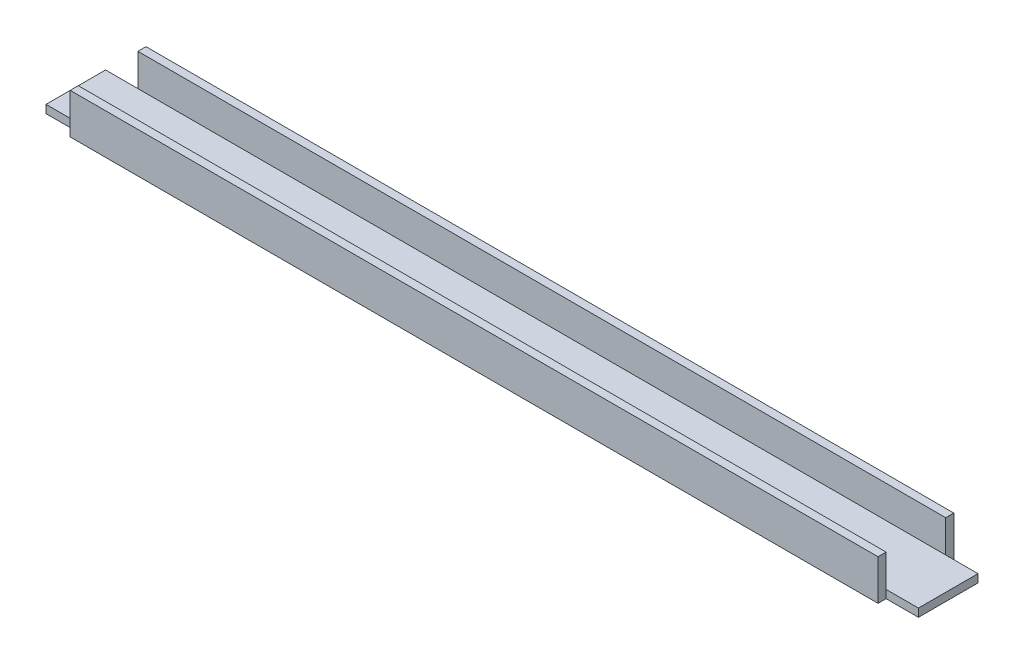
ISO-10303-21;
HEADER;
FILE_DESCRIPTION(('STEP AP214'),'2;1');
FILE_NAME('part.step','',(''),(''),'','','');
FILE_SCHEMA(('AUTOMOTIVE_DESIGN { 1 0 10303 214 1 1 1 1 }'));
ENDSEC;
DATA;
#1=APPLICATION_CONTEXT('core data for automotive mechanical design processes');
#2=APPLICATION_PROTOCOL_DEFINITION('international standard','automotive_design',2000,#1);
#3=PRODUCT_CONTEXT('',#1,'mechanical');
#4=PRODUCT('Part','Part','',(#3));
#5=PRODUCT_RELATED_PRODUCT_CATEGORY('part','',(#4));
#6=PRODUCT_DEFINITION_FORMATION('','',#4);
#7=PRODUCT_DEFINITION_CONTEXT('part definition',#1,'design');
#8=PRODUCT_DEFINITION('design','',#6,#7);
#9=PRODUCT_DEFINITION_SHAPE('','',#8);
#10=(LENGTH_UNIT() NAMED_UNIT(*) SI_UNIT(.MILLI.,.METRE.));
#11=(NAMED_UNIT(*) PLANE_ANGLE_UNIT() SI_UNIT($,.RADIAN.));
#12=(NAMED_UNIT(*) SI_UNIT($,.STERADIAN.) SOLID_ANGLE_UNIT());
#13=UNCERTAINTY_MEASURE_WITH_UNIT(LENGTH_MEASURE(1.E-05),#10,'distance_accuracy_value','');
#14=(GEOMETRIC_REPRESENTATION_CONTEXT(3) GLOBAL_UNCERTAINTY_ASSIGNED_CONTEXT((#13)) GLOBAL_UNIT_ASSIGNED_CONTEXT((#10,
#11,#12)) REPRESENTATION_CONTEXT('',''));
#15=CARTESIAN_POINT('',(0.,0.,0.));
#16=DIRECTION('',(0.,0.,1.));
#17=DIRECTION('',(1.,0.,0.));
#18=AXIS2_PLACEMENT_3D('',#15,#16,#17);
#19=CARTESIAN_POINT('',(400.,1.46957615897682E-13,0.));
#20=DIRECTION('',(-1.,0.,0.));
#21=DIRECTION('',(0.,0.,1.));
#22=AXIS2_PLACEMENT_3D('',#19,#20,#21);
#23=PLANE('',#22);
#24=DIRECTION('',(0.,-1.,0.));
#25=VECTOR('',#24,1.);
#26=CARTESIAN_POINT('',(400.,8.00000000000007,29.5));
#27=LINE('',#26,#25);
#28=CARTESIAN_POINT('',(400.,8.00000000000007,29.5));
#29=VERTEX_POINT('',#28);
#30=CARTESIAN_POINT('',(400.,0.,29.5));
#31=VERTEX_POINT('',#30);
#32=EDGE_CURVE('E199',#29,#31,#27,.T.);
#33=ORIENTED_EDGE('',*,*,#32,.F.);
#34=DIRECTION('',(0.,1.,0.));
#35=VECTOR('',#34,1.);
#36=CARTESIAN_POINT('',(400.,40.0000000000001,29.5));
#37=LINE('',#36,#35);
#38=CARTESIAN_POINT('',(400.,40.0000000000001,29.5));
#39=VERTEX_POINT('',#38);
#40=EDGE_CURVE('E234',#29,#39,#37,.T.);
#41=ORIENTED_EDGE('',*,*,#40,.T.);
#42=DIRECTION('',(0.,0.,1.));
#43=VECTOR('',#42,1.);
#44=CARTESIAN_POINT('',(400.,40.0000000000001,37.5));
#45=LINE('',#44,#43);
#46=CARTESIAN_POINT('',(400.,40.0000000000001,37.5));
#47=VERTEX_POINT('',#46);
#48=EDGE_CURVE('E236',#39,#47,#45,.T.);
#49=ORIENTED_EDGE('',*,*,#48,.T.);
#50=DIRECTION('',(0.,-1.,0.));
#51=VECTOR('',#50,1.);
#52=CARTESIAN_POINT('',(400.,1.33180339407275E-13,37.5));
#53=LINE('',#52,#51);
#54=CARTESIAN_POINT('',(400.,1.33180339407275E-13,37.5));
#55=VERTEX_POINT('',#54);
#56=EDGE_CURVE('E238',#47,#55,#53,.T.);
#57=ORIENTED_EDGE('',*,*,#56,.T.);
#58=DIRECTION('',(0.,0.,-1.));
#59=VECTOR('',#58,1.);
#60=CARTESIAN_POINT('',(400.,1.46957615897682E-13,-37.5));
#61=LINE('',#60,#59);
#62=EDGE_CURVE('E241',#55,#31,#61,.T.);
#63=ORIENTED_EDGE('',*,*,#62,.T.);
#64=EDGE_LOOP('',(#33,#41,#49,#57,#63));
#65=FACE_BOUND('',#64,.T.);
#66=ADVANCED_FACE('F68',(#65),#23,.F.);
#67=CARTESIAN_POINT('',(-400.,0.,0.));
#68=DIRECTION('',(-1.,0.,0.));
#69=DIRECTION('',(0.,0.,1.));
#70=AXIS2_PLACEMENT_3D('',#67,#68,#69);
#71=PLANE('',#70);
#72=DIRECTION('',(0.,1.,0.));
#73=VECTOR('',#72,1.);
#74=CARTESIAN_POINT('',(-400.,40.,29.5));
#75=LINE('',#74,#73);
#76=CARTESIAN_POINT('',(-400.,7.99999999999992,29.5));
#77=VERTEX_POINT('',#76);
#78=CARTESIAN_POINT('',(-400.,40.,29.5));
#79=VERTEX_POINT('',#78);
#80=EDGE_CURVE('E252',#77,#79,#75,.T.);
#81=ORIENTED_EDGE('',*,*,#80,.F.);
#82=DIRECTION('',(0.,-1.,0.));
#83=VECTOR('',#82,1.);
#84=CARTESIAN_POINT('',(-400.,7.99999999999992,29.5));
#85=LINE('',#84,#83);
#86=CARTESIAN_POINT('',(-400.,0.,29.5));
#87=VERTEX_POINT('',#86);
#88=EDGE_CURVE('E211',#77,#87,#85,.T.);
#89=ORIENTED_EDGE('',*,*,#88,.T.);
#90=DIRECTION('',(0.,0.,-1.));
#91=VECTOR('',#90,1.);
#92=CARTESIAN_POINT('',(-400.,0.,-37.5));
#93=LINE('',#92,#91);
#94=CARTESIAN_POINT('',(-400.,0.,37.5));
#95=VERTEX_POINT('',#94);
#96=EDGE_CURVE('E230',#95,#87,#93,.T.);
#97=ORIENTED_EDGE('',*,*,#96,.F.);
#98=DIRECTION('',(0.,-1.,0.));
#99=VECTOR('',#98,1.);
#100=CARTESIAN_POINT('',(-400.,0.,37.5));
#101=LINE('',#100,#99);
#102=CARTESIAN_POINT('',(-400.,40.,37.5));
#103=VERTEX_POINT('',#102);
#104=EDGE_CURVE('E256',#103,#95,#101,.T.);
#105=ORIENTED_EDGE('',*,*,#104,.F.);
#106=DIRECTION('',(0.,0.,1.));
#107=VECTOR('',#106,1.);
#108=CARTESIAN_POINT('',(-400.,40.,37.5));
#109=LINE('',#108,#107);
#110=EDGE_CURVE('E254',#79,#103,#109,.T.);
#111=ORIENTED_EDGE('',*,*,#110,.F.);
#112=EDGE_LOOP('',(#81,#89,#97,#105,#111));
#113=FACE_BOUND('',#112,.T.);
#114=ADVANCED_FACE('F305',(#113),#71,.T.);
#115=CARTESIAN_POINT('',(400.,40.0000000000001,-37.5));
#116=DIRECTION('',(0.,0.,1.));
#117=DIRECTION('',(0.,-1.,0.));
#118=AXIS2_PLACEMENT_3D('',#115,#116,#117);
#119=PLANE('',#118);
#120=DIRECTION('',(0.,1.,0.));
#121=VECTOR('',#120,1.);
#122=CARTESIAN_POINT('',(-400.,40.,-37.5));
#123=LINE('',#122,#121);
#124=CARTESIAN_POINT('',(-400.,0.,-37.5));
#125=VERTEX_POINT('',#124);
#126=CARTESIAN_POINT('',(-400.,40.,-37.5));
#127=VERTEX_POINT('',#126);
#128=EDGE_CURVE('E220',#125,#127,#123,.T.);
#129=ORIENTED_EDGE('',*,*,#128,.T.);
#130=DIRECTION('',(-1.,0.,0.));
#131=VECTOR('',#130,1.);
#132=CARTESIAN_POINT('',(400.,40.0000000000001,-37.5));
#133=LINE('',#132,#131);
#134=CARTESIAN_POINT('',(400.,40.0000000000001,-37.5));
#135=VERTEX_POINT('',#134);
#136=EDGE_CURVE('E13',#135,#127,#133,.T.);
#137=ORIENTED_EDGE('',*,*,#136,.F.);
#138=DIRECTION('',(0.,1.,0.));
#139=VECTOR('',#138,1.);
#140=CARTESIAN_POINT('',(400.,40.0000000000001,-37.5));
#141=LINE('',#140,#139);
#142=CARTESIAN_POINT('',(400.,1.46957615897682E-13,-37.5));
#143=VERTEX_POINT('',#142);
#144=EDGE_CURVE('E226',#143,#135,#141,.T.);
#145=ORIENTED_EDGE('',*,*,#144,.F.);
#146=DIRECTION('',(-1.,0.,0.));
#147=VECTOR('',#146,1.);
#148=CARTESIAN_POINT('',(400.,1.46957615897682E-13,-37.5));
#149=LINE('',#148,#147);
#150=EDGE_CURVE('E244',#143,#125,#149,.T.);
#151=ORIENTED_EDGE('',*,*,#150,.T.);
#152=EDGE_LOOP('',(#129,#137,#145,#151));
#153=FACE_BOUND('',#152,.T.);
#154=ADVANCED_FACE('F70',(#153),#119,.F.);
#155=CARTESIAN_POINT('',(400.,40.0000000000001,-29.5));
#156=DIRECTION('',(0.,-1.,0.));
#157=DIRECTION('',(0.,0.,-1.));
#158=AXIS2_PLACEMENT_3D('',#155,#156,#157);
#159=PLANE('',#158);
#160=DIRECTION('',(0.,0.,1.));
#161=VECTOR('',#160,1.);
#162=CARTESIAN_POINT('',(-400.,40.,-29.5));
#163=LINE('',#162,#161);
#164=CARTESIAN_POINT('',(-400.,40.,-29.5));
#165=VERTEX_POINT('',#164);
#166=EDGE_CURVE('E247',#127,#165,#163,.T.);
#167=ORIENTED_EDGE('',*,*,#166,.T.);
#168=DIRECTION('',(-1.,0.,0.));
#169=VECTOR('',#168,1.);
#170=CARTESIAN_POINT('',(400.,40.0000000000001,-29.5));
#171=LINE('',#170,#169);
#172=CARTESIAN_POINT('',(400.,40.0000000000001,-29.5));
#173=VERTEX_POINT('',#172);
#174=EDGE_CURVE('E76',#173,#165,#171,.T.);
#175=ORIENTED_EDGE('',*,*,#174,.F.);
#176=DIRECTION('',(0.,0.,1.));
#177=VECTOR('',#176,1.);
#178=CARTESIAN_POINT('',(400.,40.0000000000001,-29.5));
#179=LINE('',#178,#177);
#180=EDGE_CURVE('E229',#135,#173,#179,.T.);
#181=ORIENTED_EDGE('',*,*,#180,.F.);
#182=ORIENTED_EDGE('',*,*,#136,.T.);
#183=EDGE_LOOP('',(#167,#175,#181,#182));
#184=FACE_BOUND('',#183,.T.);
#185=ADVANCED_FACE('F331',(#184),#159,.F.);
#186=CARTESIAN_POINT('',(400.,8.00000000000015,-29.5));
#187=DIRECTION('',(0.,0.,-1.));
#188=DIRECTION('',(-1.,0.,0.));
#189=AXIS2_PLACEMENT_3D('',#186,#187,#188);
#190=PLANE('',#189);
#191=DIRECTION('',(0.,-1.,0.));
#192=VECTOR('',#191,1.);
#193=CARTESIAN_POINT('',(-400.,8.00000000000001,-29.5));
#194=LINE('',#193,#192);
#195=CARTESIAN_POINT('',(-400.,7.99999999999993,-29.5));
#196=VERTEX_POINT('',#195);
#197=EDGE_CURVE('E249',#165,#196,#194,.T.);
#198=ORIENTED_EDGE('',*,*,#197,.T.);
#199=DIRECTION('',(-1.,0.,0.));
#200=VECTOR('',#199,1.);
#201=CARTESIAN_POINT('',(400.,8.00000000000015,-29.5));
#202=LINE('',#201,#200);
#203=CARTESIAN_POINT('',(400.,8.00000000000008,-29.5));
#204=VERTEX_POINT('',#203);
#205=EDGE_CURVE('E275',#204,#196,#202,.T.);
#206=ORIENTED_EDGE('',*,*,#205,.F.);
#207=DIRECTION('',(0.,-1.,0.));
#208=VECTOR('',#207,1.);
#209=CARTESIAN_POINT('',(400.,8.00000000000015,-29.5));
#210=LINE('',#209,#208);
#211=EDGE_CURVE('E232',#173,#204,#210,.T.);
#212=ORIENTED_EDGE('',*,*,#211,.F.);
#213=ORIENTED_EDGE('',*,*,#174,.T.);
#214=EDGE_LOOP('',(#198,#206,#212,#213));
#215=FACE_BOUND('',#214,.T.);
#216=ADVANCED_FACE('F281',(#215),#190,.F.);
#217=CARTESIAN_POINT('',(400.,8.00000000000014,29.5));
#218=DIRECTION('',(0.,-1.,0.));
#219=DIRECTION('',(1.,0.,0.));
#220=AXIS2_PLACEMENT_3D('',#217,#218,#219);
#221=PLANE('',#220);
#222=ORIENTED_EDGE('',*,*,#205,.T.);
#223=DIRECTION('',(1.,0.,0.));
#224=VECTOR('',#223,1.);
#225=CARTESIAN_POINT('',(-400.,7.99999999999993,-29.5));
#226=LINE('',#225,#224);
#227=CARTESIAN_POINT('',(-432.,7.99999999999993,-29.5));
#228=VERTEX_POINT('',#227);
#229=EDGE_CURVE('E209',#228,#196,#226,.T.);
#230=ORIENTED_EDGE('',*,*,#229,.F.);
#231=DIRECTION('',(0.,0.,-1.));
#232=VECTOR('',#231,1.);
#233=CARTESIAN_POINT('',(-432.,7.99999999999993,-29.5));
#234=LINE('',#233,#232);
#235=CARTESIAN_POINT('',(-432.,7.99999999999991,29.5));
#236=VERTEX_POINT('',#235);
#237=EDGE_CURVE('E205',#236,#228,#234,.T.);
#238=ORIENTED_EDGE('',*,*,#237,.F.);
#239=DIRECTION('',(-1.,0.,0.));
#240=VECTOR('',#239,1.);
#241=CARTESIAN_POINT('',(-400.,7.99999999999992,29.5));
#242=LINE('',#241,#240);
#243=EDGE_CURVE('E202',#77,#236,#242,.T.);
#244=ORIENTED_EDGE('',*,*,#243,.F.);
#245=DIRECTION('',(-1.,0.,0.));
#246=VECTOR('',#245,1.);
#247=CARTESIAN_POINT('',(400.,8.00000000000014,29.5));
#248=LINE('',#247,#246);
#249=EDGE_CURVE('E272',#29,#77,#248,.T.);
#250=ORIENTED_EDGE('',*,*,#249,.F.);
#251=DIRECTION('',(-1.,0.,0.));
#252=VECTOR('',#251,1.);
#253=CARTESIAN_POINT('',(400.,8.00000000000007,29.5));
#254=LINE('',#253,#252);
#255=CARTESIAN_POINT('',(432.,8.00000000000007,29.5));
#256=VERTEX_POINT('',#255);
#257=EDGE_CURVE('E177',#256,#29,#254,.T.);
#258=ORIENTED_EDGE('',*,*,#257,.F.);
#259=DIRECTION('',(0.,0.,1.));
#260=VECTOR('',#259,1.);
#261=CARTESIAN_POINT('',(432.,8.00000000000009,-29.5));
#262=LINE('',#261,#260);
#263=CARTESIAN_POINT('',(432.,8.00000000000009,-29.5));
#264=VERTEX_POINT('',#263);
#265=EDGE_CURVE('E172',#264,#256,#262,.T.);
#266=ORIENTED_EDGE('',*,*,#265,.F.);
#267=DIRECTION('',(1.,0.,0.));
#268=VECTOR('',#267,1.);
#269=CARTESIAN_POINT('',(400.,8.00000000000008,-29.5));
#270=LINE('',#269,#268);
#271=EDGE_CURVE('E184',#204,#264,#270,.T.);
#272=ORIENTED_EDGE('',*,*,#271,.F.);
#273=EDGE_LOOP('',(#222,#230,#238,#244,#250,#258,#266,#272));
#274=FACE_BOUND('',#273,.T.);
#275=ADVANCED_FACE('F183',(#274),#221,.F.);
#276=CARTESIAN_POINT('',(400.,40.0000000000001,29.5));
#277=DIRECTION('',(0.,0.,1.));
#278=DIRECTION('',(0.,-1.,0.));
#279=AXIS2_PLACEMENT_3D('',#276,#277,#278);
#280=PLANE('',#279);
#281=ORIENTED_EDGE('',*,*,#80,.T.);
#282=DIRECTION('',(-1.,0.,0.));
#283=VECTOR('',#282,1.);
#284=CARTESIAN_POINT('',(400.,40.0000000000001,29.5));
#285=LINE('',#284,#283);
#286=EDGE_CURVE('E269',#39,#79,#285,.T.);
#287=ORIENTED_EDGE('',*,*,#286,.F.);
#288=ORIENTED_EDGE('',*,*,#40,.F.);
#289=ORIENTED_EDGE('',*,*,#249,.T.);
#290=EDGE_LOOP('',(#281,#287,#288,#289));
#291=FACE_BOUND('',#290,.T.);
#292=ADVANCED_FACE('F320',(#291),#280,.F.);
#293=CARTESIAN_POINT('',(400.,40.0000000000001,37.5));
#294=DIRECTION('',(0.,-1.,0.));
#295=DIRECTION('',(0.,0.,-1.));
#296=AXIS2_PLACEMENT_3D('',#293,#294,#295);
#297=PLANE('',#296);
#298=ORIENTED_EDGE('',*,*,#110,.T.);
#299=DIRECTION('',(-1.,0.,0.));
#300=VECTOR('',#299,1.);
#301=CARTESIAN_POINT('',(400.,40.0000000000001,37.5));
#302=LINE('',#301,#300);
#303=EDGE_CURVE('E266',#47,#103,#302,.T.);
#304=ORIENTED_EDGE('',*,*,#303,.F.);
#305=ORIENTED_EDGE('',*,*,#48,.F.);
#306=ORIENTED_EDGE('',*,*,#286,.T.);
#307=EDGE_LOOP('',(#298,#304,#305,#306));
#308=FACE_BOUND('',#307,.T.);
#309=ADVANCED_FACE('F315',(#308),#297,.F.);
#310=CARTESIAN_POINT('',(400.,1.33180339407275E-13,37.5));
#311=DIRECTION('',(0.,0.,-1.));
#312=DIRECTION('',(-1.,0.,0.));
#313=AXIS2_PLACEMENT_3D('',#310,#311,#312);
#314=PLANE('',#313);
#315=ORIENTED_EDGE('',*,*,#104,.T.);
#316=DIRECTION('',(-1.,0.,0.));
#317=VECTOR('',#316,1.);
#318=CARTESIAN_POINT('',(400.,1.33180339407275E-13,37.5));
#319=LINE('',#318,#317);
#320=EDGE_CURVE('E263',#55,#95,#319,.T.);
#321=ORIENTED_EDGE('',*,*,#320,.F.);
#322=ORIENTED_EDGE('',*,*,#56,.F.);
#323=ORIENTED_EDGE('',*,*,#303,.T.);
#324=EDGE_LOOP('',(#315,#321,#322,#323));
#325=FACE_BOUND('',#324,.T.);
#326=ADVANCED_FACE('F312',(#325),#314,.F.);
#327=CARTESIAN_POINT('',(400.,1.46957615897682E-13,-37.5));
#328=DIRECTION('',(0.,1.,0.));
#329=DIRECTION('',(0.,0.,1.));
#330=AXIS2_PLACEMENT_3D('',#327,#328,#329);
#331=PLANE('',#330);
#332=ORIENTED_EDGE('',*,*,#96,.T.);
#333=DIRECTION('',(-1.,0.,0.));
#334=VECTOR('',#333,1.);
#335=CARTESIAN_POINT('',(-400.,0.,29.5));
#336=LINE('',#335,#334);
#337=CARTESIAN_POINT('',(-432.,0.,29.5));
#338=VERTEX_POINT('',#337);
#339=EDGE_CURVE('E91',#87,#338,#336,.T.);
#340=ORIENTED_EDGE('',*,*,#339,.T.);
#341=DIRECTION('',(0.,0.,-1.));
#342=VECTOR('',#341,1.);
#343=CARTESIAN_POINT('',(-432.,0.,-29.5));
#344=LINE('',#343,#342);
#345=CARTESIAN_POINT('',(-432.,0.,-29.5));
#346=VERTEX_POINT('',#345);
#347=EDGE_CURVE('E213',#338,#346,#344,.T.);
#348=ORIENTED_EDGE('',*,*,#347,.T.);
#349=DIRECTION('',(1.,0.,0.));
#350=VECTOR('',#349,1.);
#351=CARTESIAN_POINT('',(-400.,0.,-29.5));
#352=LINE('',#351,#350);
#353=CARTESIAN_POINT('',(-400.,0.,-29.5));
#354=VERTEX_POINT('',#353);
#355=EDGE_CURVE('E206',#346,#354,#352,.T.);
#356=ORIENTED_EDGE('',*,*,#355,.T.);
#357=EDGE_CURVE('E258',#354,#125,#93,.T.);
#358=ORIENTED_EDGE('',*,*,#357,.T.);
#359=ORIENTED_EDGE('',*,*,#150,.F.);
#360=CARTESIAN_POINT('',(400.,1.45488039738706E-13,-29.5));
#361=VERTEX_POINT('',#360);
#362=EDGE_CURVE('E240',#361,#143,#61,.T.);
#363=ORIENTED_EDGE('',*,*,#362,.F.);
#364=DIRECTION('',(1.,0.,0.));
#365=VECTOR('',#364,1.);
#366=CARTESIAN_POINT('',(400.,0.,-29.5));
#367=LINE('',#366,#365);
#368=CARTESIAN_POINT('',(432.,0.,-29.5));
#369=VERTEX_POINT('',#368);
#370=EDGE_CURVE('E83',#361,#369,#367,.T.);
#371=ORIENTED_EDGE('',*,*,#370,.T.);
#372=DIRECTION('',(0.,0.,1.));
#373=VECTOR('',#372,1.);
#374=CARTESIAN_POINT('',(432.,0.,-29.5));
#375=LINE('',#374,#373);
#376=CARTESIAN_POINT('',(432.,0.,29.5));
#377=VERTEX_POINT('',#376);
#378=EDGE_CURVE('E174',#369,#377,#375,.T.);
#379=ORIENTED_EDGE('',*,*,#378,.T.);
#380=DIRECTION('',(-1.,0.,0.));
#381=VECTOR('',#380,1.);
#382=CARTESIAN_POINT('',(400.,0.,29.5));
#383=LINE('',#382,#381);
#384=EDGE_CURVE('E190',#377,#31,#383,.T.);
#385=ORIENTED_EDGE('',*,*,#384,.T.);
#386=ORIENTED_EDGE('',*,*,#62,.F.);
#387=ORIENTED_EDGE('',*,*,#320,.T.);
#388=EDGE_LOOP('',(#332,#340,#348,#356,#358,#359,#363,#371,#379,#385,#386,#387));
#389=FACE_BOUND('',#388,.T.);
#390=ADVANCED_FACE('F294',(#389),#331,.F.);
#391=ORIENTED_EDGE('',*,*,#211,.T.);
#392=DIRECTION('',(0.,-1.,0.));
#393=VECTOR('',#392,1.);
#394=CARTESIAN_POINT('',(400.,8.00000000000008,-29.5));
#395=LINE('',#394,#393);
#396=EDGE_CURVE('E189',#204,#361,#395,.T.);
#397=ORIENTED_EDGE('',*,*,#396,.T.);
#398=ORIENTED_EDGE('',*,*,#362,.T.);
#399=ORIENTED_EDGE('',*,*,#144,.T.);
#400=ORIENTED_EDGE('',*,*,#180,.T.);
#401=EDGE_LOOP('',(#391,#397,#398,#399,#400));
#402=FACE_BOUND('',#401,.T.);
#403=ADVANCED_FACE('F329',(#402),#23,.F.);
#404=DIRECTION('',(0.,-1.,0.));
#405=VECTOR('',#404,1.);
#406=CARTESIAN_POINT('',(-400.,7.99999999999993,-29.5));
#407=LINE('',#406,#405);
#408=EDGE_CURVE('E218',#196,#354,#407,.T.);
#409=ORIENTED_EDGE('',*,*,#408,.F.);
#410=ORIENTED_EDGE('',*,*,#197,.F.);
#411=ORIENTED_EDGE('',*,*,#166,.F.);
#412=ORIENTED_EDGE('',*,*,#128,.F.);
#413=ORIENTED_EDGE('',*,*,#357,.F.);
#414=EDGE_LOOP('',(#409,#410,#411,#412,#413));
#415=FACE_BOUND('',#414,.T.);
#416=ADVANCED_FACE('F286',(#415),#71,.T.);
#417=CARTESIAN_POINT('',(-400.,7.99999999999993,-29.5));
#418=DIRECTION('',(0.,0.,-1.));
#419=DIRECTION('',(-1.,0.,0.));
#420=AXIS2_PLACEMENT_3D('',#417,#418,#419);
#421=PLANE('',#420);
#422=ORIENTED_EDGE('',*,*,#355,.F.);
#423=DIRECTION('',(0.,-1.,0.));
#424=VECTOR('',#423,1.);
#425=CARTESIAN_POINT('',(-432.,7.99999999999993,-29.5));
#426=LINE('',#425,#424);
#427=EDGE_CURVE('E221',#228,#346,#426,.T.);
#428=ORIENTED_EDGE('',*,*,#427,.F.);
#429=ORIENTED_EDGE('',*,*,#229,.T.);
#430=ORIENTED_EDGE('',*,*,#408,.T.);
#431=EDGE_LOOP('',(#422,#428,#429,#430));
#432=FACE_BOUND('',#431,.T.);
#433=ADVANCED_FACE('F291',(#432),#421,.T.);
#434=CARTESIAN_POINT('',(-432.,7.99999999999993,-29.5));
#435=DIRECTION('',(-1.,0.,0.));
#436=DIRECTION('',(0.,-1.,0.));
#437=AXIS2_PLACEMENT_3D('',#434,#435,#436);
#438=PLANE('',#437);
#439=ORIENTED_EDGE('',*,*,#347,.F.);
#440=DIRECTION('',(0.,-1.,0.));
#441=VECTOR('',#440,1.);
#442=CARTESIAN_POINT('',(-432.,7.99999999999991,29.5));
#443=LINE('',#442,#441);
#444=EDGE_CURVE('E223',#236,#338,#443,.T.);
#445=ORIENTED_EDGE('',*,*,#444,.F.);
#446=ORIENTED_EDGE('',*,*,#237,.T.);
#447=ORIENTED_EDGE('',*,*,#427,.T.);
#448=EDGE_LOOP('',(#439,#445,#446,#447));
#449=FACE_BOUND('',#448,.T.);
#450=ADVANCED_FACE('F298',(#449),#438,.T.);
#451=CARTESIAN_POINT('',(-400.,7.99999999999992,29.5));
#452=DIRECTION('',(0.,0.,1.));
#453=DIRECTION('',(1.,0.,0.));
#454=AXIS2_PLACEMENT_3D('',#451,#452,#453);
#455=PLANE('',#454);
#456=ORIENTED_EDGE('',*,*,#339,.F.);
#457=ORIENTED_EDGE('',*,*,#88,.F.);
#458=ORIENTED_EDGE('',*,*,#243,.T.);
#459=ORIENTED_EDGE('',*,*,#444,.T.);
#460=EDGE_LOOP('',(#456,#457,#458,#459));
#461=FACE_BOUND('',#460,.T.);
#462=ADVANCED_FACE('F301',(#461),#455,.T.);
#463=CARTESIAN_POINT('',(400.,8.00000000000008,-29.5));
#464=DIRECTION('',(0.,0.,-1.));
#465=DIRECTION('',(-1.,0.,0.));
#466=AXIS2_PLACEMENT_3D('',#463,#464,#465);
#467=PLANE('',#466);
#468=ORIENTED_EDGE('',*,*,#370,.F.);
#469=ORIENTED_EDGE('',*,*,#396,.F.);
#470=ORIENTED_EDGE('',*,*,#271,.T.);
#471=DIRECTION('',(0.,-1.,0.));
#472=VECTOR('',#471,1.);
#473=CARTESIAN_POINT('',(432.,8.00000000000009,-29.5));
#474=LINE('',#473,#472);
#475=EDGE_CURVE('E169',#264,#369,#474,.T.);
#476=ORIENTED_EDGE('',*,*,#475,.T.);
#477=EDGE_LOOP('',(#468,#469,#470,#476));
#478=FACE_BOUND('',#477,.T.);
#479=ADVANCED_FACE('F188',(#478),#467,.T.);
#480=CARTESIAN_POINT('',(400.,8.00000000000007,29.5));
#481=DIRECTION('',(0.,0.,1.));
#482=DIRECTION('',(1.,0.,0.));
#483=AXIS2_PLACEMENT_3D('',#480,#481,#482);
#484=PLANE('',#483);
#485=ORIENTED_EDGE('',*,*,#384,.F.);
#486=DIRECTION('',(0.,-1.,0.));
#487=VECTOR('',#486,1.);
#488=CARTESIAN_POINT('',(432.,8.00000000000007,29.5));
#489=LINE('',#488,#487);
#490=EDGE_CURVE('E176',#256,#377,#489,.T.);
#491=ORIENTED_EDGE('',*,*,#490,.F.);
#492=ORIENTED_EDGE('',*,*,#257,.T.);
#493=ORIENTED_EDGE('',*,*,#32,.T.);
#494=EDGE_LOOP('',(#485,#491,#492,#493));
#495=FACE_BOUND('',#494,.T.);
#496=ADVANCED_FACE('F325',(#495),#484,.T.);
#497=CARTESIAN_POINT('',(432.,8.00000000000009,-29.5));
#498=DIRECTION('',(1.,0.,0.));
#499=DIRECTION('',(0.,1.,0.));
#500=AXIS2_PLACEMENT_3D('',#497,#498,#499);
#501=PLANE('',#500);
#502=ORIENTED_EDGE('',*,*,#378,.F.);
#503=ORIENTED_EDGE('',*,*,#475,.F.);
#504=ORIENTED_EDGE('',*,*,#265,.T.);
#505=ORIENTED_EDGE('',*,*,#490,.T.);
#506=EDGE_LOOP('',(#502,#503,#504,#505));
#507=FACE_BOUND('',#506,.T.);
#508=ADVANCED_FACE('F171',(#507),#501,.T.);
#509=CLOSED_SHELL('',(#66,#114,#154,#185,#216,#275,#292,#309,#326,#390,#403,#416,#433,#450,#462,
#479,#496,#508));
#510=MANIFOLD_SOLID_BREP('B2',#509);
#511=ADVANCED_BREP_SHAPE_REPRESENTATION('',(#18,#510),#14);
#512=SHAPE_DEFINITION_REPRESENTATION(#9,#511);
ENDSEC;
END-ISO-10303-21;
